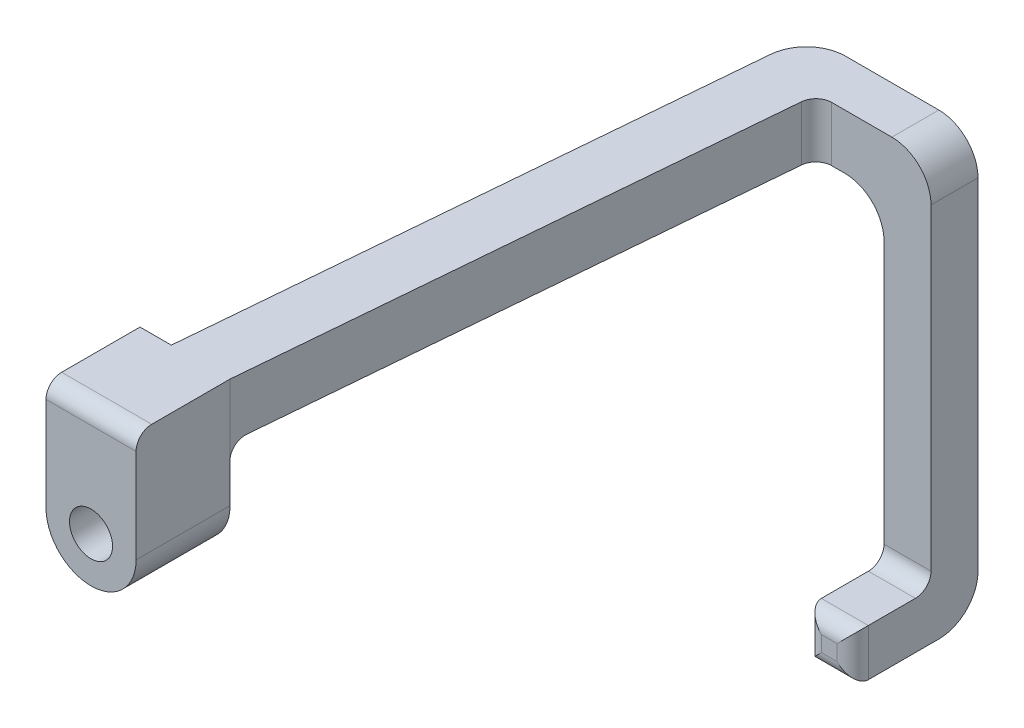
ISO-10303-21;
HEADER;
FILE_DESCRIPTION(('STEP AP214'),'2;1');
FILE_NAME('part.step','',(''),(''),'','','');
FILE_SCHEMA(('AUTOMOTIVE_DESIGN { 1 0 10303 214 1 1 1 1 }'));
ENDSEC;
DATA;
#1=APPLICATION_CONTEXT('core data for automotive mechanical design processes');
#2=APPLICATION_PROTOCOL_DEFINITION('international standard','automotive_design',2000,#1);
#3=PRODUCT_CONTEXT('',#1,'mechanical');
#4=PRODUCT('Part','Part','',(#3));
#5=PRODUCT_RELATED_PRODUCT_CATEGORY('part','',(#4));
#6=PRODUCT_DEFINITION_FORMATION('','',#4);
#7=PRODUCT_DEFINITION_CONTEXT('part definition',#1,'design');
#8=PRODUCT_DEFINITION('design','',#6,#7);
#9=PRODUCT_DEFINITION_SHAPE('','',#8);
#10=(LENGTH_UNIT() NAMED_UNIT(*) SI_UNIT(.MILLI.,.METRE.));
#11=(NAMED_UNIT(*) PLANE_ANGLE_UNIT() SI_UNIT($,.RADIAN.));
#12=(NAMED_UNIT(*) SI_UNIT($,.STERADIAN.) SOLID_ANGLE_UNIT());
#13=UNCERTAINTY_MEASURE_WITH_UNIT(LENGTH_MEASURE(1.E-05),#10,'distance_accuracy_value','');
#14=(GEOMETRIC_REPRESENTATION_CONTEXT(3) GLOBAL_UNCERTAINTY_ASSIGNED_CONTEXT((#13)) GLOBAL_UNIT_ASSIGNED_CONTEXT((#10,
#11,#12)) REPRESENTATION_CONTEXT('',''));
#15=CARTESIAN_POINT('',(0.,0.,0.));
#16=DIRECTION('',(0.,0.,1.));
#17=DIRECTION('',(1.,0.,0.));
#18=AXIS2_PLACEMENT_3D('',#15,#16,#17);
#19=CARTESIAN_POINT('',(1.37658783702771,7.,-34.5));
#20=DIRECTION('',(0.,0.,1.));
#21=DIRECTION('',(1.,0.,0.));
#22=AXIS2_PLACEMENT_3D('',#19,#20,#21);
#23=PLANE('',#22);
#24=DIRECTION('',(1.,0.,0.));
#25=VECTOR('',#24,1.);
#26=CARTESIAN_POINT('',(1.37658783702771,7.,-34.5));
#27=LINE('',#26,#25);
#28=CARTESIAN_POINT('',(6.78208186315099,7.,-34.5));
#29=VERTEX_POINT('',#28);
#30=CARTESIAN_POINT('',(10.625,7.,-34.5));
#31=VERTEX_POINT('',#30);
#32=EDGE_CURVE('E220',#29,#31,#27,.T.);
#33=ORIENTED_EDGE('',*,*,#32,.F.);
#34=DIRECTION('',(0.,-1.,0.));
#35=VECTOR('',#34,1.);
#36=CARTESIAN_POINT('',(6.78208186315099,7.,-34.5));
#37=LINE('',#36,#35);
#38=CARTESIAN_POINT('',(6.78208186315099,3.5,-34.5));
#39=VERTEX_POINT('',#38);
#40=EDGE_CURVE('E373',#29,#39,#37,.T.);
#41=ORIENTED_EDGE('',*,*,#40,.T.);
#42=DIRECTION('',(1.,0.,0.));
#43=VECTOR('',#42,1.);
#44=CARTESIAN_POINT('',(1.37658783702771,3.5,-34.5));
#45=LINE('',#44,#43);
#46=CARTESIAN_POINT('',(7.625,3.5,-34.5));
#47=VERTEX_POINT('',#46);
#48=EDGE_CURVE('E377',#39,#47,#45,.T.);
#49=ORIENTED_EDGE('',*,*,#48,.T.);
#50=CARTESIAN_POINT('',(7.625,0.999999999999999,-34.5));
#51=DIRECTION('',(0.,0.,1.));
#52=DIRECTION('',(1.,0.,0.));
#53=AXIS2_PLACEMENT_3D('',#50,#51,#52);
#54=CIRCLE('',#53,2.5);
#55=CARTESIAN_POINT('',(10.125,0.99999999999999,-34.5));
#56=VERTEX_POINT('',#55);
#57=EDGE_CURVE('E527',#47,#56,#54,.F.);
#58=ORIENTED_EDGE('',*,*,#57,.T.);
#59=DIRECTION('',(0.,1.,0.));
#60=VECTOR('',#59,1.);
#61=CARTESIAN_POINT('',(10.125,-19.75,-34.5));
#62=LINE('',#61,#60);
#63=CARTESIAN_POINT('',(10.125,-15.75,-34.5));
#64=VERTEX_POINT('',#63);
#65=EDGE_CURVE('E473',#64,#56,#62,.T.);
#66=ORIENTED_EDGE('',*,*,#65,.F.);
#67=DIRECTION('',(-1.,0.,0.));
#68=VECTOR('',#67,1.);
#69=CARTESIAN_POINT('',(1.37658783702771,-15.75,-34.5));
#70=LINE('',#69,#68);
#71=CARTESIAN_POINT('',(13.125,-15.75,-34.5));
#72=VERTEX_POINT('',#71);
#73=EDGE_CURVE('E385',#64,#72,#70,.F.);
#74=ORIENTED_EDGE('',*,*,#73,.T.);
#75=DIRECTION('',(0.,-1.,0.));
#76=VECTOR('',#75,1.);
#77=CARTESIAN_POINT('',(13.125,7.,-34.5));
#78=LINE('',#77,#76);
#79=CARTESIAN_POINT('',(13.125,4.5,-34.5));
#80=VERTEX_POINT('',#79);
#81=EDGE_CURVE('E480',#80,#72,#78,.T.);
#82=ORIENTED_EDGE('',*,*,#81,.F.);
#83=CARTESIAN_POINT('',(10.625,4.5,-34.5));
#84=DIRECTION('',(0.,0.,1.));
#85=DIRECTION('',(1.,0.,0.));
#86=AXIS2_PLACEMENT_3D('',#83,#84,#85);
#87=CIRCLE('',#86,2.5);
#88=EDGE_CURVE('E376',#80,#31,#87,.T.);
#89=ORIENTED_EDGE('',*,*,#88,.T.);
#90=EDGE_LOOP('',(#33,#41,#49,#58,#66,#74,#82,#89));
#91=FACE_BOUND('',#90,.T.);
#92=ADVANCED_FACE('F49',(#91),#23,.T.);
#93=CARTESIAN_POINT('',(0.,0.,6.));
#94=DIRECTION('',(0.,0.,1.));
#95=DIRECTION('',(1.,0.,0.));
#96=AXIS2_PLACEMENT_3D('',#93,#94,#95);
#97=PLANE('',#96);
#98=DIRECTION('',(0.,1.,0.));
#99=VECTOR('',#98,1.);
#100=CARTESIAN_POINT('',(2.875,0.,6.));
#101=LINE('',#100,#99);
#102=CARTESIAN_POINT('',(2.875,0.,6.));
#103=VERTEX_POINT('',#102);
#104=CARTESIAN_POINT('',(2.875,6.,6.));
#105=VERTEX_POINT('',#104);
#106=EDGE_CURVE('E278',#103,#105,#101,.T.);
#107=ORIENTED_EDGE('',*,*,#106,.T.);
#108=DIRECTION('',(-1.,0.,0.));
#109=VECTOR('',#108,1.);
#110=CARTESIAN_POINT('',(-2.875,6.,6.));
#111=LINE('',#110,#109);
#112=CARTESIAN_POINT('',(-2.875,6.,6.));
#113=VERTEX_POINT('',#112);
#114=EDGE_CURVE('E387',#105,#113,#111,.T.);
#115=ORIENTED_EDGE('',*,*,#114,.T.);
#116=DIRECTION('',(0.,-1.,0.));
#117=VECTOR('',#116,1.);
#118=CARTESIAN_POINT('',(-2.875,0.,6.));
#119=LINE('',#118,#117);
#120=CARTESIAN_POINT('',(-2.875,0.,6.));
#121=VERTEX_POINT('',#120);
#122=EDGE_CURVE('E282',#113,#121,#119,.T.);
#123=ORIENTED_EDGE('',*,*,#122,.T.);
#124=CARTESIAN_POINT('',(0.,0.,6.));
#125=DIRECTION('',(0.,0.,1.));
#126=DIRECTION('',(1.,0.,0.));
#127=AXIS2_PLACEMENT_3D('',#124,#125,#126);
#128=CIRCLE('',#127,2.875);
#129=EDGE_CURVE('E275',#121,#103,#128,.T.);
#130=ORIENTED_EDGE('',*,*,#129,.T.);
#131=EDGE_LOOP('',(#107,#115,#123,#130));
#132=FACE_BOUND('',#131,.T.);
#133=CARTESIAN_POINT('',(0.,0.,6.));
#134=DIRECTION('',(0.,0.,1.));
#135=DIRECTION('',(1.,0.,0.));
#136=AXIS2_PLACEMENT_3D('',#133,#134,#135);
#137=CIRCLE('',#136,1.375);
#138=CARTESIAN_POINT('',(1.375,0.,6.));
#139=VERTEX_POINT('',#138);
#140=EDGE_CURVE('E264',#139,#139,#137,.T.);
#141=ORIENTED_EDGE('',*,*,#140,.F.);
#142=EDGE_LOOP('',(#141));
#143=FACE_BOUND('',#142,.T.);
#144=ADVANCED_FACE('F361',(#132,#143),#97,.T.);
#145=CARTESIAN_POINT('',(0.,0.,0.));
#146=DIRECTION('',(0.,0.,1.));
#147=DIRECTION('',(1.,0.,0.));
#148=AXIS2_PLACEMENT_3D('',#145,#146,#147);
#149=PLANE('',#148);
#150=DIRECTION('',(0.,1.,0.));
#151=VECTOR('',#150,1.);
#152=CARTESIAN_POINT('',(-0.875,7.,0.));
#153=LINE('',#152,#151);
#154=CARTESIAN_POINT('',(-0.875,2.5,0.));
#155=VERTEX_POINT('',#154);
#156=CARTESIAN_POINT('',(-0.875,7.,0.));
#157=VERTEX_POINT('',#156);
#158=EDGE_CURVE('E67',#155,#157,#153,.T.);
#159=ORIENTED_EDGE('',*,*,#158,.F.);
#160=DIRECTION('',(-1.,0.,0.));
#161=VECTOR('',#160,1.);
#162=CARTESIAN_POINT('',(2.875,2.5,0.));
#163=LINE('',#162,#161);
#164=CARTESIAN_POINT('',(2.875,2.5,0.));
#165=VERTEX_POINT('',#164);
#166=EDGE_CURVE('E424',#155,#165,#163,.F.);
#167=ORIENTED_EDGE('',*,*,#166,.T.);
#168=DIRECTION('',(0.,1.,0.));
#169=VECTOR('',#168,1.);
#170=CARTESIAN_POINT('',(2.875,0.,0.));
#171=LINE('',#170,#169);
#172=CARTESIAN_POINT('',(2.875,0.,0.));
#173=VERTEX_POINT('',#172);
#174=EDGE_CURVE('E287',#173,#165,#171,.T.);
#175=ORIENTED_EDGE('',*,*,#174,.F.);
#176=CARTESIAN_POINT('',(0.,0.,0.));
#177=DIRECTION('',(0.,0.,1.));
#178=DIRECTION('',(1.,0.,0.));
#179=AXIS2_PLACEMENT_3D('',#176,#177,#178);
#180=CIRCLE('',#179,2.875);
#181=CARTESIAN_POINT('',(-2.875,0.,0.));
#182=VERTEX_POINT('',#181);
#183=EDGE_CURVE('E272',#182,#173,#180,.T.);
#184=ORIENTED_EDGE('',*,*,#183,.F.);
#185=DIRECTION('',(0.,-1.,0.));
#186=VECTOR('',#185,1.);
#187=CARTESIAN_POINT('',(-2.875,0.,0.));
#188=LINE('',#187,#186);
#189=CARTESIAN_POINT('',(-2.875,7.,0.));
#190=VERTEX_POINT('',#189);
#191=EDGE_CURVE('E279',#190,#182,#188,.T.);
#192=ORIENTED_EDGE('',*,*,#191,.F.);
#193=DIRECTION('',(-1.,0.,0.));
#194=VECTOR('',#193,1.);
#195=CARTESIAN_POINT('',(2.875,7.,0.));
#196=LINE('',#195,#194);
#197=EDGE_CURVE('E296',#157,#190,#196,.T.);
#198=ORIENTED_EDGE('',*,*,#197,.F.);
#199=EDGE_LOOP('',(#159,#167,#175,#184,#192,#198));
#200=FACE_BOUND('',#199,.T.);
#201=CARTESIAN_POINT('',(0.,0.,0.));
#202=DIRECTION('',(0.,0.,1.));
#203=DIRECTION('',(1.,0.,0.));
#204=AXIS2_PLACEMENT_3D('',#201,#202,#203);
#205=CIRCLE('',#204,1.375);
#206=CARTESIAN_POINT('',(1.375,0.,0.));
#207=VERTEX_POINT('',#206);
#208=EDGE_CURVE('E230',#207,#207,#205,.T.);
#209=ORIENTED_EDGE('',*,*,#208,.T.);
#210=EDGE_LOOP('',(#209));
#211=FACE_BOUND('',#210,.T.);
#212=ADVANCED_FACE('F367',(#200,#211),#149,.F.);
#213=CARTESIAN_POINT('',(0.,0.,6.));
#214=DIRECTION('',(0.,0.,-1.));
#215=DIRECTION('',(-1.,0.,0.));
#216=AXIS2_PLACEMENT_3D('',#213,#214,#215);
#217=CYLINDRICAL_SURFACE('',#216,2.875);
#218=ORIENTED_EDGE('',*,*,#183,.T.);
#219=DIRECTION('',(0.,0.,-1.));
#220=VECTOR('',#219,1.);
#221=CARTESIAN_POINT('',(2.875,0.,6.));
#222=LINE('',#221,#220);
#223=EDGE_CURVE('E305',#103,#173,#222,.T.);
#224=ORIENTED_EDGE('',*,*,#223,.F.);
#225=ORIENTED_EDGE('',*,*,#129,.F.);
#226=DIRECTION('',(0.,0.,-1.));
#227=VECTOR('',#226,1.);
#228=CARTESIAN_POINT('',(-2.875,0.,6.));
#229=LINE('',#228,#227);
#230=EDGE_CURVE('E284',#121,#182,#229,.T.);
#231=ORIENTED_EDGE('',*,*,#230,.T.);
#232=EDGE_LOOP('',(#218,#224,#225,#231));
#233=FACE_BOUND('',#232,.T.);
#234=ADVANCED_FACE('F417',(#233),#217,.T.);
#235=CARTESIAN_POINT('',(2.875,0.,6.));
#236=DIRECTION('',(-1.,0.,0.));
#237=DIRECTION('',(0.,-1.,0.));
#238=AXIS2_PLACEMENT_3D('',#235,#236,#237);
#239=PLANE('',#238);
#240=DIRECTION('',(0.,0.,-1.));
#241=VECTOR('',#240,1.);
#242=CARTESIAN_POINT('',(2.875,7.,6.));
#243=LINE('',#242,#241);
#244=CARTESIAN_POINT('',(2.875,7.,5.));
#245=VERTEX_POINT('',#244);
#246=CARTESIAN_POINT('',(2.875,7.,0.));
#247=VERTEX_POINT('',#246);
#248=EDGE_CURVE('E302',#245,#247,#243,.T.);
#249=ORIENTED_EDGE('',*,*,#248,.F.);
#250=CARTESIAN_POINT('',(2.875,6.,5.));
#251=DIRECTION('',(-1.,0.,0.));
#252=DIRECTION('',(0.,-1.,0.));
#253=AXIS2_PLACEMENT_3D('',#250,#251,#252);
#254=CIRCLE('',#253,1.);
#255=EDGE_CURVE('E311',#245,#105,#254,.F.);
#256=ORIENTED_EDGE('',*,*,#255,.T.);
#257=ORIENTED_EDGE('',*,*,#106,.F.);
#258=ORIENTED_EDGE('',*,*,#223,.T.);
#259=ORIENTED_EDGE('',*,*,#174,.T.);
#260=DIRECTION('',(0.,-1.,0.));
#261=VECTOR('',#260,1.);
#262=CARTESIAN_POINT('',(2.875,3.5,0.));
#263=LINE('',#262,#261);
#264=EDGE_CURVE('E427',#247,#165,#263,.T.);
#265=ORIENTED_EDGE('',*,*,#264,.F.);
#266=EDGE_LOOP('',(#249,#256,#257,#258,#259,#265));
#267=FACE_BOUND('',#266,.T.);
#268=ADVANCED_FACE('F409',(#267),#239,.F.);
#269=CARTESIAN_POINT('',(2.875,7.,6.));
#270=DIRECTION('',(0.,-1.,0.));
#271=DIRECTION('',(0.,0.,-1.));
#272=AXIS2_PLACEMENT_3D('',#269,#270,#271);
#273=PLANE('',#272);
#274=DIRECTION('',(0.,0.,-1.));
#275=VECTOR('',#274,1.);
#276=CARTESIAN_POINT('',(-2.875,7.,6.));
#277=LINE('',#276,#275);
#278=CARTESIAN_POINT('',(-2.875,7.,5.));
#279=VERTEX_POINT('',#278);
#280=EDGE_CURVE('E306',#279,#190,#277,.T.);
#281=ORIENTED_EDGE('',*,*,#280,.F.);
#282=DIRECTION('',(-1.,0.,0.));
#283=VECTOR('',#282,1.);
#284=CARTESIAN_POINT('',(2.875,7.,5.));
#285=LINE('',#284,#283);
#286=EDGE_CURVE('E309',#279,#245,#285,.F.);
#287=ORIENTED_EDGE('',*,*,#286,.T.);
#288=ORIENTED_EDGE('',*,*,#248,.T.);
#289=DIRECTION('',(0.0863430073291471,0.,-0.996265469182466));
#290=VECTOR('',#289,1.);
#291=CARTESIAN_POINT('',(2.875,7.,0.));
#292=LINE('',#291,#290);
#293=CARTESIAN_POINT('',(5.78581639396853,7.,-33.5863430073291));
#294=VERTEX_POINT('',#293);
#295=EDGE_CURVE('E327',#247,#294,#292,.T.);
#296=ORIENTED_EDGE('',*,*,#295,.T.);
#297=CARTESIAN_POINT('',(6.78208186315099,7.,-33.5));
#298=DIRECTION('',(0.,-1.,0.));
#299=DIRECTION('',(0.,0.,-1.));
#300=AXIS2_PLACEMENT_3D('',#297,#298,#299);
#301=CIRCLE('',#300,1.);
#302=EDGE_CURVE('E382',#294,#29,#301,.T.);
#303=ORIENTED_EDGE('',*,*,#302,.T.);
#304=ORIENTED_EDGE('',*,*,#32,.T.);
#305=DIRECTION('',(0.,0.,1.));
#306=VECTOR('',#305,1.);
#307=CARTESIAN_POINT('',(10.625,7.,-37.5));
#308=LINE('',#307,#306);
#309=CARTESIAN_POINT('',(10.625,7.,-37.5));
#310=VERTEX_POINT('',#309);
#311=EDGE_CURVE('E217',#31,#310,#308,.F.);
#312=ORIENTED_EDGE('',*,*,#311,.T.);
#313=DIRECTION('',(-1.,0.,0.));
#314=VECTOR('',#313,1.);
#315=CARTESIAN_POINT('',(13.125,7.,-37.5));
#316=LINE('',#315,#314);
#317=CARTESIAN_POINT('',(6.125,7.,-37.5));
#318=VERTEX_POINT('',#317);
#319=EDGE_CURVE('E210',#310,#318,#316,.T.);
#320=ORIENTED_EDGE('',*,*,#319,.T.);
#321=DIRECTION('',(1.,0.,0.));
#322=VECTOR('',#321,1.);
#323=CARTESIAN_POINT('',(6.125,7.,-37.5));
#324=LINE('',#323,#322);
#325=CARTESIAN_POINT('',(4.66770465787748,7.,-37.5));
#326=VERTEX_POINT('',#325);
#327=EDGE_CURVE('E214',#326,#318,#324,.T.);
#328=ORIENTED_EDGE('',*,*,#327,.F.);
#329=CARTESIAN_POINT('',(4.66770465787748,7.,-35.));
#330=DIRECTION('',(0.,-1.,0.));
#331=DIRECTION('',(0.,0.,-1.));
#332=AXIS2_PLACEMENT_3D('',#329,#330,#331);
#333=CIRCLE('',#332,2.5);
#334=CARTESIAN_POINT('',(2.17704098492132,7.,-35.2158575183229));
#335=VERTEX_POINT('',#334);
#336=EDGE_CURVE('E513',#326,#335,#333,.F.);
#337=ORIENTED_EDGE('',*,*,#336,.T.);
#338=DIRECTION('',(0.0863430073291471,0.,-0.996265469182466));
#339=VECTOR('',#338,1.);
#340=CARTESIAN_POINT('',(-0.875,7.,0.));
#341=LINE('',#340,#339);
#342=EDGE_CURVE('E324',#157,#335,#341,.T.);
#343=ORIENTED_EDGE('',*,*,#342,.F.);
#344=ORIENTED_EDGE('',*,*,#197,.T.);
#345=EDGE_LOOP('',(#281,#287,#288,#296,#303,#304,#312,#320,#328,#337,#343,#344));
#346=FACE_BOUND('',#345,.T.);
#347=ADVANCED_FACE('F213',(#346),#273,.F.);
#348=CARTESIAN_POINT('',(-2.875,0.,6.));
#349=DIRECTION('',(1.,0.,0.));
#350=DIRECTION('',(0.,1.,0.));
#351=AXIS2_PLACEMENT_3D('',#348,#349,#350);
#352=PLANE('',#351);
#353=ORIENTED_EDGE('',*,*,#122,.F.);
#354=CARTESIAN_POINT('',(-2.875,6.,5.));
#355=DIRECTION('',(1.,0.,0.));
#356=DIRECTION('',(0.,1.,0.));
#357=AXIS2_PLACEMENT_3D('',#354,#355,#356);
#358=CIRCLE('',#357,1.);
#359=EDGE_CURVE('E307',#113,#279,#358,.F.);
#360=ORIENTED_EDGE('',*,*,#359,.T.);
#361=ORIENTED_EDGE('',*,*,#280,.T.);
#362=ORIENTED_EDGE('',*,*,#191,.T.);
#363=ORIENTED_EDGE('',*,*,#230,.F.);
#364=EDGE_LOOP('',(#353,#360,#361,#362,#363));
#365=FACE_BOUND('',#364,.T.);
#366=ADVANCED_FACE('F397',(#365),#352,.F.);
#367=CARTESIAN_POINT('',(0.,0.,6.));
#368=DIRECTION('',(0.,0.,-1.));
#369=DIRECTION('',(-1.,0.,0.));
#370=AXIS2_PLACEMENT_3D('',#367,#368,#369);
#371=CYLINDRICAL_SURFACE('',#370,1.375);
#372=ORIENTED_EDGE('',*,*,#140,.T.);
#373=EDGE_LOOP('',(#372));
#374=FACE_BOUND('',#373,.T.);
#375=ORIENTED_EDGE('',*,*,#208,.F.);
#376=EDGE_LOOP('',(#375));
#377=FACE_BOUND('',#376,.T.);
#378=ADVANCED_FACE('F256',(#374,#377),#371,.F.);
#379=CARTESIAN_POINT('',(0.,0.,-37.5));
#380=DIRECTION('',(0.,0.,1.));
#381=DIRECTION('',(1.,0.,0.));
#382=AXIS2_PLACEMENT_3D('',#379,#380,#381);
#383=PLANE('',#382);
#384=DIRECTION('',(0.,1.,0.));
#385=VECTOR('',#384,1.);
#386=CARTESIAN_POINT('',(13.125,7.,-37.5));
#387=LINE('',#386,#385);
#388=CARTESIAN_POINT('',(13.125,-17.25,-37.5));
#389=VERTEX_POINT('',#388);
#390=CARTESIAN_POINT('',(13.125,4.5,-37.5));
#391=VERTEX_POINT('',#390);
#392=EDGE_CURVE('E475',#389,#391,#387,.T.);
#393=ORIENTED_EDGE('',*,*,#392,.F.);
#394=DIRECTION('',(-1.,0.,0.));
#395=VECTOR('',#394,1.);
#396=CARTESIAN_POINT('',(0.,-17.25,-37.5));
#397=LINE('',#396,#395);
#398=CARTESIAN_POINT('',(10.125,-17.25,-37.5));
#399=VERTEX_POINT('',#398);
#400=EDGE_CURVE('E495',#389,#399,#397,.T.);
#401=ORIENTED_EDGE('',*,*,#400,.T.);
#402=DIRECTION('',(0.,1.,0.));
#403=VECTOR('',#402,1.);
#404=CARTESIAN_POINT('',(10.125,-19.75,-37.5));
#405=LINE('',#404,#403);
#406=CARTESIAN_POINT('',(10.125,0.99999999999999,-37.5));
#407=VERTEX_POINT('',#406);
#408=EDGE_CURVE('E472',#399,#407,#405,.T.);
#409=ORIENTED_EDGE('',*,*,#408,.T.);
#410=CARTESIAN_POINT('',(7.625,0.999999999999999,-37.5));
#411=DIRECTION('',(0.,0.,1.));
#412=DIRECTION('',(1.,0.,0.));
#413=AXIS2_PLACEMENT_3D('',#410,#411,#412);
#414=CIRCLE('',#413,2.5);
#415=CARTESIAN_POINT('',(7.625,3.5,-37.5));
#416=VERTEX_POINT('',#415);
#417=EDGE_CURVE('E529',#407,#416,#414,.T.);
#418=ORIENTED_EDGE('',*,*,#417,.T.);
#419=DIRECTION('',(-1.,0.,0.));
#420=VECTOR('',#419,1.);
#421=CARTESIAN_POINT('',(13.125,3.5,-37.5));
#422=LINE('',#421,#420);
#423=CARTESIAN_POINT('',(6.125,3.5,-37.5));
#424=VERTEX_POINT('',#423);
#425=EDGE_CURVE('E221',#416,#424,#422,.T.);
#426=ORIENTED_EDGE('',*,*,#425,.T.);
#427=DIRECTION('',(-1.,0.,0.));
#428=VECTOR('',#427,1.);
#429=CARTESIAN_POINT('',(2.375,3.5,-37.5));
#430=LINE('',#429,#428);
#431=CARTESIAN_POINT('',(4.66770465787748,3.5,-37.5));
#432=VERTEX_POINT('',#431);
#433=EDGE_CURVE('E231',#424,#432,#430,.T.);
#434=ORIENTED_EDGE('',*,*,#433,.T.);
#435=DIRECTION('',(0.,1.,0.));
#436=VECTOR('',#435,1.);
#437=CARTESIAN_POINT('',(4.66770465787748,0.,-37.5));
#438=LINE('',#437,#436);
#439=EDGE_CURVE('E229',#432,#326,#438,.T.);
#440=ORIENTED_EDGE('',*,*,#439,.T.);
#441=ORIENTED_EDGE('',*,*,#327,.T.);
#442=ORIENTED_EDGE('',*,*,#319,.F.);
#443=CARTESIAN_POINT('',(10.625,4.5,-37.5));
#444=DIRECTION('',(0.,0.,1.));
#445=DIRECTION('',(1.,0.,0.));
#446=AXIS2_PLACEMENT_3D('',#443,#444,#445);
#447=CIRCLE('',#446,2.5);
#448=EDGE_CURVE('E419',#310,#391,#447,.F.);
#449=ORIENTED_EDGE('',*,*,#448,.T.);
#450=EDGE_LOOP('',(#393,#401,#409,#418,#426,#434,#440,#441,#442,#449));
#451=FACE_BOUND('',#450,.T.);
#452=ADVANCED_FACE('F226',(#451),#383,.F.);
#453=CARTESIAN_POINT('',(0.,3.5,0.));
#454=DIRECTION('',(0.,1.,0.));
#455=DIRECTION('',(-1.,0.,0.));
#456=AXIS2_PLACEMENT_3D('',#453,#454,#455);
#457=PLANE('',#456);
#458=DIRECTION('',(0.0863430073291471,0.,-0.996265469182466));
#459=VECTOR('',#458,1.);
#460=CARTESIAN_POINT('',(2.875,3.5,0.));
#461=LINE('',#460,#459);
#462=CARTESIAN_POINT('',(2.96166666666667,3.5,-1.));
#463=VERTEX_POINT('',#462);
#464=CARTESIAN_POINT('',(5.78581639396853,3.5,-33.5863430073291));
#465=VERTEX_POINT('',#464);
#466=EDGE_CURVE('E317',#463,#465,#461,.T.);
#467=ORIENTED_EDGE('',*,*,#466,.F.);
#468=DIRECTION('',(-1.,0.,0.));
#469=VECTOR('',#468,1.);
#470=CARTESIAN_POINT('',(-0.875,3.5,-1.));
#471=LINE('',#470,#469);
#472=CARTESIAN_POINT('',(-0.788333333333334,3.5,-1.));
#473=VERTEX_POINT('',#472);
#474=EDGE_CURVE('E313',#463,#473,#471,.T.);
#475=ORIENTED_EDGE('',*,*,#474,.T.);
#476=DIRECTION('',(0.0863430073291471,0.,-0.996265469182466));
#477=VECTOR('',#476,1.);
#478=CARTESIAN_POINT('',(-0.875,3.5,0.));
#479=LINE('',#478,#477);
#480=CARTESIAN_POINT('',(2.17704098492132,3.5,-35.2158575183229));
#481=VERTEX_POINT('',#480);
#482=EDGE_CURVE('E314',#473,#481,#479,.T.);
#483=ORIENTED_EDGE('',*,*,#482,.T.);
#484=CARTESIAN_POINT('',(4.66770465787748,3.5,-35.));
#485=DIRECTION('',(0.,1.,0.));
#486=DIRECTION('',(-1.,0.,0.));
#487=AXIS2_PLACEMENT_3D('',#484,#485,#486);
#488=CIRCLE('',#487,2.5);
#489=EDGE_CURVE('E522',#481,#432,#488,.F.);
#490=ORIENTED_EDGE('',*,*,#489,.T.);
#491=ORIENTED_EDGE('',*,*,#433,.F.);
#492=ORIENTED_EDGE('',*,*,#425,.F.);
#493=DIRECTION('',(0.,0.,1.));
#494=VECTOR('',#493,1.);
#495=CARTESIAN_POINT('',(7.625,3.5,0.));
#496=LINE('',#495,#494);
#497=EDGE_CURVE('E520',#416,#47,#496,.T.);
#498=ORIENTED_EDGE('',*,*,#497,.T.);
#499=ORIENTED_EDGE('',*,*,#48,.F.);
#500=CARTESIAN_POINT('',(6.78208186315099,3.5,-33.5));
#501=DIRECTION('',(0.,1.,0.));
#502=DIRECTION('',(-1.,0.,0.));
#503=AXIS2_PLACEMENT_3D('',#500,#501,#502);
#504=CIRCLE('',#503,1.);
#505=EDGE_CURVE('E383',#39,#465,#504,.T.);
#506=ORIENTED_EDGE('',*,*,#505,.T.);
#507=EDGE_LOOP('',(#467,#475,#483,#490,#491,#492,#498,#499,#506));
#508=FACE_BOUND('',#507,.T.);
#509=ADVANCED_FACE('F255',(#508),#457,.F.);
#510=CARTESIAN_POINT('',(2.85356654462041,0.,0.247309100533769));
#511=DIRECTION('',(-0.996265469182466,0.,-0.0863430073291471));
#512=DIRECTION('',(-0.0863430073291471,0.,0.996265469182466));
#513=AXIS2_PLACEMENT_3D('',#510,#511,#512);
#514=PLANE('',#513);
#515=ORIENTED_EDGE('',*,*,#466,.T.);
#516=DIRECTION('',(0.,-1.,0.));
#517=VECTOR('',#516,1.);
#518=CARTESIAN_POINT('',(5.78581639396853,0.,-33.5863430073291));
#519=LINE('',#518,#517);
#520=EDGE_CURVE('E384',#465,#294,#519,.F.);
#521=ORIENTED_EDGE('',*,*,#520,.T.);
#522=ORIENTED_EDGE('',*,*,#295,.F.);
#523=ORIENTED_EDGE('',*,*,#264,.T.);
#524=CARTESIAN_POINT('',(2.96166666666667,2.5,-1.));
#525=DIRECTION('',(-0.996265469182466,0.,-0.0863430073291471));
#526=DIRECTION('',(0.0863430073291471,0.,-0.996265469182466));
#527=AXIS2_PLACEMENT_3D('',#524,#525,#526);
#528=ELLIPSE('',#527,1.00374852981766,1.);
#529=EDGE_CURVE('E12',#165,#463,#528,.T.);
#530=ORIENTED_EDGE('',*,*,#529,.T.);
#531=EDGE_LOOP('',(#515,#521,#522,#523,#530));
#532=FACE_BOUND('',#531,.T.);
#533=ADVANCED_FACE('F350',(#532),#514,.F.);
#534=CARTESIAN_POINT('',(-0.868476774449691,0.,-0.0752679871189733));
#535=DIRECTION('',(0.996265469182466,0.,0.0863430073291471));
#536=DIRECTION('',(0.0863430073291471,0.,-0.996265469182466));
#537=AXIS2_PLACEMENT_3D('',#534,#535,#536);
#538=PLANE('',#537);
#539=ORIENTED_EDGE('',*,*,#342,.T.);
#540=DIRECTION('',(0.,1.,0.));
#541=VECTOR('',#540,1.);
#542=CARTESIAN_POINT('',(2.17704098492131,0.,-35.2158575183229));
#543=LINE('',#542,#541);
#544=EDGE_CURVE('E515',#335,#481,#543,.F.);
#545=ORIENTED_EDGE('',*,*,#544,.T.);
#546=ORIENTED_EDGE('',*,*,#482,.F.);
#547=CARTESIAN_POINT('',(-0.788333333333335,2.5,-1.));
#548=DIRECTION('',(0.996265469182466,0.,0.0863430073291471));
#549=DIRECTION('',(0.0863430073291471,0.,-0.996265469182466));
#550=AXIS2_PLACEMENT_3D('',#547,#548,#549);
#551=ELLIPSE('',#550,1.00374852981766,1.);
#552=EDGE_CURVE('E59',#473,#155,#551,.T.);
#553=ORIENTED_EDGE('',*,*,#552,.T.);
#554=ORIENTED_EDGE('',*,*,#158,.T.);
#555=EDGE_LOOP('',(#539,#545,#546,#553,#554));
#556=FACE_BOUND('',#555,.T.);
#557=ADVANCED_FACE('F257',(#556),#538,.F.);
#558=CARTESIAN_POINT('',(13.125,0.,0.));
#559=DIRECTION('',(1.,0.,0.));
#560=DIRECTION('',(0.,0.,-1.));
#561=AXIS2_PLACEMENT_3D('',#558,#559,#560);
#562=PLANE('',#561);
#563=DIRECTION('',(0.,0.,-1.));
#564=VECTOR('',#563,1.);
#565=CARTESIAN_POINT('',(13.125,-16.75,-29.5));
#566=LINE('',#565,#564);
#567=CARTESIAN_POINT('',(13.125,-16.75,-30.5));
#568=VERTEX_POINT('',#567);
#569=CARTESIAN_POINT('',(13.125,-16.75,-33.5));
#570=VERTEX_POINT('',#569);
#571=EDGE_CURVE('E459',#568,#570,#566,.T.);
#572=ORIENTED_EDGE('',*,*,#571,.F.);
#573=DIRECTION('',(0.,1.,0.));
#574=VECTOR('',#573,1.);
#575=CARTESIAN_POINT('',(13.125,-19.75,-30.5));
#576=LINE('',#575,#574);
#577=CARTESIAN_POINT('',(13.125,-19.75,-30.5));
#578=VERTEX_POINT('',#577);
#579=EDGE_CURVE('E548',#568,#578,#576,.F.);
#580=ORIENTED_EDGE('',*,*,#579,.T.);
#581=DIRECTION('',(0.,0.,-1.));
#582=VECTOR('',#581,1.);
#583=CARTESIAN_POINT('',(13.125,-19.75,0.));
#584=LINE('',#583,#582);
#585=CARTESIAN_POINT('',(13.125,-19.75,-35.));
#586=VERTEX_POINT('',#585);
#587=EDGE_CURVE('E465',#578,#586,#584,.T.);
#588=ORIENTED_EDGE('',*,*,#587,.T.);
#589=CARTESIAN_POINT('',(13.125,-17.25,-35.));
#590=DIRECTION('',(1.,0.,0.));
#591=DIRECTION('',(0.,0.,-1.));
#592=AXIS2_PLACEMENT_3D('',#589,#590,#591);
#593=CIRCLE('',#592,2.5);
#594=EDGE_CURVE('E510',#586,#389,#593,.T.);
#595=ORIENTED_EDGE('',*,*,#594,.T.);
#596=ORIENTED_EDGE('',*,*,#392,.T.);
#597=DIRECTION('',(0.,0.,1.));
#598=VECTOR('',#597,1.);
#599=CARTESIAN_POINT('',(13.125,4.5,-34.5));
#600=LINE('',#599,#598);
#601=EDGE_CURVE('E507',#391,#80,#600,.T.);
#602=ORIENTED_EDGE('',*,*,#601,.T.);
#603=ORIENTED_EDGE('',*,*,#81,.T.);
#604=CARTESIAN_POINT('',(13.125,-15.75,-33.5));
#605=DIRECTION('',(1.,0.,0.));
#606=DIRECTION('',(0.,0.,-1.));
#607=AXIS2_PLACEMENT_3D('',#604,#605,#606);
#608=CIRCLE('',#607,1.);
#609=EDGE_CURVE('E440',#72,#570,#608,.F.);
#610=ORIENTED_EDGE('',*,*,#609,.T.);
#611=EDGE_LOOP('',(#572,#580,#588,#595,#596,#602,#603,#610));
#612=FACE_BOUND('',#611,.T.);
#613=ADVANCED_FACE('F357',(#612),#562,.T.);
#614=CARTESIAN_POINT('',(10.125,-19.75,0.));
#615=DIRECTION('',(-1.,0.,0.));
#616=DIRECTION('',(0.,0.,1.));
#617=AXIS2_PLACEMENT_3D('',#614,#615,#616);
#618=PLANE('',#617);
#619=DIRECTION('',(0.,0.,1.));
#620=VECTOR('',#619,1.);
#621=CARTESIAN_POINT('',(10.125,-19.75,0.));
#622=LINE('',#621,#620);
#623=CARTESIAN_POINT('',(10.125,-19.75,-35.));
#624=VERTEX_POINT('',#623);
#625=CARTESIAN_POINT('',(10.125,-19.75,-30.5));
#626=VERTEX_POINT('',#625);
#627=EDGE_CURVE('E469',#624,#626,#622,.T.);
#628=ORIENTED_EDGE('',*,*,#627,.T.);
#629=DIRECTION('',(0.,-1.,0.));
#630=VECTOR('',#629,1.);
#631=CARTESIAN_POINT('',(10.125,-16.75,-30.5));
#632=LINE('',#631,#630);
#633=CARTESIAN_POINT('',(10.125,-16.75,-30.5));
#634=VERTEX_POINT('',#633);
#635=EDGE_CURVE('E541',#626,#634,#632,.F.);
#636=ORIENTED_EDGE('',*,*,#635,.T.);
#637=DIRECTION('',(0.,0.,-1.));
#638=VECTOR('',#637,1.);
#639=CARTESIAN_POINT('',(10.125,-16.75,-29.5));
#640=LINE('',#639,#638);
#641=CARTESIAN_POINT('',(10.125,-16.75,-33.5));
#642=VERTEX_POINT('',#641);
#643=EDGE_CURVE('E453',#634,#642,#640,.T.);
#644=ORIENTED_EDGE('',*,*,#643,.T.);
#645=CARTESIAN_POINT('',(10.125,-15.75,-33.5));
#646=DIRECTION('',(-1.,0.,0.));
#647=DIRECTION('',(0.,0.,1.));
#648=AXIS2_PLACEMENT_3D('',#645,#646,#647);
#649=CIRCLE('',#648,1.);
#650=EDGE_CURVE('E436',#642,#64,#649,.F.);
#651=ORIENTED_EDGE('',*,*,#650,.T.);
#652=ORIENTED_EDGE('',*,*,#65,.T.);
#653=DIRECTION('',(0.,0.,1.));
#654=VECTOR('',#653,1.);
#655=CARTESIAN_POINT('',(10.125,0.999999999999997,0.));
#656=LINE('',#655,#654);
#657=EDGE_CURVE('E500',#56,#407,#656,.F.);
#658=ORIENTED_EDGE('',*,*,#657,.T.);
#659=ORIENTED_EDGE('',*,*,#408,.F.);
#660=CARTESIAN_POINT('',(10.125,-17.25,-35.));
#661=DIRECTION('',(-1.,0.,0.));
#662=DIRECTION('',(0.,0.,1.));
#663=AXIS2_PLACEMENT_3D('',#660,#661,#662);
#664=CIRCLE('',#663,2.5);
#665=EDGE_CURVE('E502',#399,#624,#664,.T.);
#666=ORIENTED_EDGE('',*,*,#665,.T.);
#667=EDGE_LOOP('',(#628,#636,#644,#651,#652,#658,#659,#666));
#668=FACE_BOUND('',#667,.T.);
#669=ADVANCED_FACE('F556',(#668),#618,.T.);
#670=CARTESIAN_POINT('',(0.,-19.75,0.));
#671=DIRECTION('',(0.,1.,0.));
#672=DIRECTION('',(-1.,0.,0.));
#673=AXIS2_PLACEMENT_3D('',#670,#671,#672);
#674=PLANE('',#673);
#675=ORIENTED_EDGE('',*,*,#587,.F.);
#676=DIRECTION('',(1.,0.,0.));
#677=VECTOR('',#676,1.);
#678=CARTESIAN_POINT('',(0.,-19.75,-30.5));
#679=LINE('',#678,#677);
#680=EDGE_CURVE('E389',#578,#626,#679,.F.);
#681=ORIENTED_EDGE('',*,*,#680,.T.);
#682=ORIENTED_EDGE('',*,*,#627,.F.);
#683=DIRECTION('',(-1.,0.,0.));
#684=VECTOR('',#683,1.);
#685=CARTESIAN_POINT('',(0.,-19.75,-35.));
#686=LINE('',#685,#684);
#687=EDGE_CURVE('E504',#624,#586,#686,.F.);
#688=ORIENTED_EDGE('',*,*,#687,.T.);
#689=EDGE_LOOP('',(#675,#681,#682,#688));
#690=FACE_BOUND('',#689,.T.);
#691=ADVANCED_FACE('F552',(#690),#674,.F.);
#692=CARTESIAN_POINT('',(13.125,-16.75,-29.5));
#693=DIRECTION('',(0.,-1.,0.));
#694=DIRECTION('',(0.,0.,-1.));
#695=AXIS2_PLACEMENT_3D('',#692,#693,#694);
#696=PLANE('',#695);
#697=ORIENTED_EDGE('',*,*,#643,.F.);
#698=DIRECTION('',(-1.,0.,0.));
#699=VECTOR('',#698,1.);
#700=CARTESIAN_POINT('',(13.125,-16.75,-30.5));
#701=LINE('',#700,#699);
#702=EDGE_CURVE('E546',#634,#568,#701,.F.);
#703=ORIENTED_EDGE('',*,*,#702,.T.);
#704=ORIENTED_EDGE('',*,*,#571,.T.);
#705=DIRECTION('',(-1.,0.,0.));
#706=VECTOR('',#705,1.);
#707=CARTESIAN_POINT('',(13.125,-16.75,-33.5));
#708=LINE('',#707,#706);
#709=EDGE_CURVE('E543',#570,#642,#708,.T.);
#710=ORIENTED_EDGE('',*,*,#709,.T.);
#711=EDGE_LOOP('',(#697,#703,#704,#710));
#712=FACE_BOUND('',#711,.T.);
#713=ADVANCED_FACE('F569',(#712),#696,.F.);
#714=CARTESIAN_POINT('',(0.,0.,-29.5));
#715=DIRECTION('',(0.,0.,-1.));
#716=DIRECTION('',(-1.,0.,0.));
#717=AXIS2_PLACEMENT_3D('',#714,#715,#716);
#718=PLANE('',#717);
#719=DIRECTION('',(-1.,0.,0.));
#720=VECTOR('',#719,1.);
#721=CARTESIAN_POINT('',(0.,-17.75,-29.5));
#722=LINE('',#721,#720);
#723=CARTESIAN_POINT('',(12.125,-17.75,-29.5));
#724=VERTEX_POINT('',#723);
#725=CARTESIAN_POINT('',(11.125,-17.75,-29.5));
#726=VERTEX_POINT('',#725);
#727=EDGE_CURVE('E536',#724,#726,#722,.T.);
#728=ORIENTED_EDGE('',*,*,#727,.T.);
#729=DIRECTION('',(0.,-1.,0.));
#730=VECTOR('',#729,1.);
#731=CARTESIAN_POINT('',(11.125,-19.75,-29.5));
#732=LINE('',#731,#730);
#733=CARTESIAN_POINT('',(11.125,-18.75,-29.5));
#734=VERTEX_POINT('',#733);
#735=EDGE_CURVE('E538',#726,#734,#732,.T.);
#736=ORIENTED_EDGE('',*,*,#735,.T.);
#737=DIRECTION('',(1.,0.,0.));
#738=VECTOR('',#737,1.);
#739=CARTESIAN_POINT('',(0.,-18.75,-29.5));
#740=LINE('',#739,#738);
#741=CARTESIAN_POINT('',(12.125,-18.75,-29.5));
#742=VERTEX_POINT('',#741);
#743=EDGE_CURVE('E530',#734,#742,#740,.T.);
#744=ORIENTED_EDGE('',*,*,#743,.T.);
#745=DIRECTION('',(0.,1.,0.));
#746=VECTOR('',#745,1.);
#747=CARTESIAN_POINT('',(12.125,-16.75,-29.5));
#748=LINE('',#747,#746);
#749=EDGE_CURVE('E534',#742,#724,#748,.T.);
#750=ORIENTED_EDGE('',*,*,#749,.T.);
#751=EDGE_LOOP('',(#728,#736,#744,#750));
#752=FACE_BOUND('',#751,.T.);
#753=ADVANCED_FACE('F565',(#752),#718,.F.);
#754=CARTESIAN_POINT('',(0.,-17.25,-35.));
#755=DIRECTION('',(-1.,0.,0.));
#756=DIRECTION('',(0.,-1.,0.));
#757=AXIS2_PLACEMENT_3D('',#754,#755,#756);
#758=CYLINDRICAL_SURFACE('',#757,2.5);
#759=ORIENTED_EDGE('',*,*,#594,.F.);
#760=ORIENTED_EDGE('',*,*,#687,.F.);
#761=ORIENTED_EDGE('',*,*,#665,.F.);
#762=ORIENTED_EDGE('',*,*,#400,.F.);
#763=EDGE_LOOP('',(#759,#760,#761,#762));
#764=FACE_BOUND('',#763,.T.);
#765=ADVANCED_FACE('F667',(#764),#758,.T.);
#766=CARTESIAN_POINT('',(4.66770465787748,0.,-35.));
#767=DIRECTION('',(0.,1.,0.));
#768=DIRECTION('',(-1.,0.,0.));
#769=AXIS2_PLACEMENT_3D('',#766,#767,#768);
#770=CYLINDRICAL_SURFACE('',#769,2.5);
#771=ORIENTED_EDGE('',*,*,#489,.F.);
#772=ORIENTED_EDGE('',*,*,#544,.F.);
#773=ORIENTED_EDGE('',*,*,#336,.F.);
#774=ORIENTED_EDGE('',*,*,#439,.F.);
#775=EDGE_LOOP('',(#771,#772,#773,#774));
#776=FACE_BOUND('',#775,.T.);
#777=ADVANCED_FACE('F657',(#776),#770,.T.);
#778=CARTESIAN_POINT('',(7.625,0.999999999999999,0.));
#779=DIRECTION('',(0.,0.,1.));
#780=DIRECTION('',(0.,-1.,0.));
#781=AXIS2_PLACEMENT_3D('',#778,#779,#780);
#782=CYLINDRICAL_SURFACE('',#781,2.5);
#783=ORIENTED_EDGE('',*,*,#417,.F.);
#784=ORIENTED_EDGE('',*,*,#657,.F.);
#785=ORIENTED_EDGE('',*,*,#57,.F.);
#786=ORIENTED_EDGE('',*,*,#497,.F.);
#787=EDGE_LOOP('',(#783,#784,#785,#786));
#788=FACE_BOUND('',#787,.T.);
#789=ADVANCED_FACE('F584',(#788),#782,.F.);
#790=CARTESIAN_POINT('',(10.625,4.5,0.));
#791=DIRECTION('',(0.,0.,-1.));
#792=DIRECTION('',(-1.,0.,0.));
#793=AXIS2_PLACEMENT_3D('',#790,#791,#792);
#794=CYLINDRICAL_SURFACE('',#793,2.5);
#795=ORIENTED_EDGE('',*,*,#448,.F.);
#796=ORIENTED_EDGE('',*,*,#311,.F.);
#797=ORIENTED_EDGE('',*,*,#88,.F.);
#798=ORIENTED_EDGE('',*,*,#601,.F.);
#799=EDGE_LOOP('',(#795,#796,#797,#798));
#800=FACE_BOUND('',#799,.T.);
#801=ADVANCED_FACE('F577',(#800),#794,.T.);
#802=CARTESIAN_POINT('',(12.125,0.,-30.5));
#803=DIRECTION('',(0.,-1.,0.));
#804=DIRECTION('',(0.,0.,-1.));
#805=AXIS2_PLACEMENT_3D('',#802,#803,#804);
#806=CYLINDRICAL_SURFACE('',#805,1.);
#807=CARTESIAN_POINT('',(12.125,-18.75,-30.5));
#808=DIRECTION('',(0.707106781186548,0.707106781186547,0.));
#809=DIRECTION('',(0.707106781186547,-0.707106781186548,0.));
#810=AXIS2_PLACEMENT_3D('',#807,#808,#809);
#811=ELLIPSE('',#810,1.4142135623731,1.);
#812=EDGE_CURVE('E446',#578,#742,#811,.F.);
#813=ORIENTED_EDGE('',*,*,#812,.F.);
#814=ORIENTED_EDGE('',*,*,#579,.F.);
#815=CARTESIAN_POINT('',(12.125,-17.75,-30.5));
#816=DIRECTION('',(0.707106781186547,-0.707106781186547,0.));
#817=DIRECTION('',(-0.707106781186547,-0.707106781186547,0.));
#818=AXIS2_PLACEMENT_3D('',#815,#816,#817);
#819=ELLIPSE('',#818,1.41421356237309,1.);
#820=EDGE_CURVE('E53',#724,#568,#819,.F.);
#821=ORIENTED_EDGE('',*,*,#820,.F.);
#822=ORIENTED_EDGE('',*,*,#749,.F.);
#823=EDGE_LOOP('',(#813,#814,#821,#822));
#824=FACE_BOUND('',#823,.T.);
#825=ADVANCED_FACE('F575',(#824),#806,.T.);
#826=CARTESIAN_POINT('',(0.,-17.75,-30.5));
#827=DIRECTION('',(-1.,0.,0.));
#828=DIRECTION('',(0.,0.,1.));
#829=AXIS2_PLACEMENT_3D('',#826,#827,#828);
#830=CYLINDRICAL_SURFACE('',#829,1.);
#831=ORIENTED_EDGE('',*,*,#820,.T.);
#832=ORIENTED_EDGE('',*,*,#702,.F.);
#833=CARTESIAN_POINT('',(11.125,-17.75,-30.5));
#834=DIRECTION('',(-0.707106781186547,-0.707106781186547,0.));
#835=DIRECTION('',(-0.707106781186547,0.707106781186547,0.));
#836=AXIS2_PLACEMENT_3D('',#833,#834,#835);
#837=ELLIPSE('',#836,1.41421356237309,1.);
#838=EDGE_CURVE('E445',#726,#634,#837,.T.);
#839=ORIENTED_EDGE('',*,*,#838,.F.);
#840=ORIENTED_EDGE('',*,*,#727,.F.);
#841=EDGE_LOOP('',(#831,#832,#839,#840));
#842=FACE_BOUND('',#841,.T.);
#843=ADVANCED_FACE('F566',(#842),#830,.T.);
#844=CARTESIAN_POINT('',(0.,-18.75,-30.5));
#845=DIRECTION('',(1.,0.,0.));
#846=DIRECTION('',(0.,1.,0.));
#847=AXIS2_PLACEMENT_3D('',#844,#845,#846);
#848=CYLINDRICAL_SURFACE('',#847,1.);
#849=ORIENTED_EDGE('',*,*,#812,.T.);
#850=ORIENTED_EDGE('',*,*,#743,.F.);
#851=CARTESIAN_POINT('',(11.125,-18.75,-30.5));
#852=DIRECTION('',(0.707106781186547,-0.707106781186548,0.));
#853=DIRECTION('',(0.707106781186548,0.707106781186547,0.));
#854=AXIS2_PLACEMENT_3D('',#851,#852,#853);
#855=ELLIPSE('',#854,1.41421356237309,1.);
#856=EDGE_CURVE('E443',#626,#734,#855,.F.);
#857=ORIENTED_EDGE('',*,*,#856,.F.);
#858=ORIENTED_EDGE('',*,*,#680,.F.);
#859=EDGE_LOOP('',(#849,#850,#857,#858));
#860=FACE_BOUND('',#859,.T.);
#861=ADVANCED_FACE('F562',(#860),#848,.T.);
#862=CARTESIAN_POINT('',(11.125,0.,-30.5));
#863=DIRECTION('',(0.,1.,0.));
#864=DIRECTION('',(0.,0.,1.));
#865=AXIS2_PLACEMENT_3D('',#862,#863,#864);
#866=CYLINDRICAL_SURFACE('',#865,1.);
#867=ORIENTED_EDGE('',*,*,#838,.T.);
#868=ORIENTED_EDGE('',*,*,#635,.F.);
#869=ORIENTED_EDGE('',*,*,#856,.T.);
#870=ORIENTED_EDGE('',*,*,#735,.F.);
#871=EDGE_LOOP('',(#867,#868,#869,#870));
#872=FACE_BOUND('',#871,.T.);
#873=ADVANCED_FACE('F559',(#872),#866,.T.);
#874=CARTESIAN_POINT('',(6.78208186315099,7.,-33.5));
#875=DIRECTION('',(0.,-1.,0.));
#876=DIRECTION('',(0.,0.,-1.));
#877=AXIS2_PLACEMENT_3D('',#874,#875,#876);
#878=CYLINDRICAL_SURFACE('',#877,1.);
#879=ORIENTED_EDGE('',*,*,#302,.F.);
#880=ORIENTED_EDGE('',*,*,#520,.F.);
#881=ORIENTED_EDGE('',*,*,#505,.F.);
#882=ORIENTED_EDGE('',*,*,#40,.F.);
#883=EDGE_LOOP('',(#879,#880,#881,#882));
#884=FACE_BOUND('',#883,.T.);
#885=ADVANCED_FACE('F380',(#884),#878,.F.);
#886=CARTESIAN_POINT('',(13.125,-15.75,-33.5));
#887=DIRECTION('',(-1.,0.,0.));
#888=DIRECTION('',(0.,0.,1.));
#889=AXIS2_PLACEMENT_3D('',#886,#887,#888);
#890=CYLINDRICAL_SURFACE('',#889,1.);
#891=ORIENTED_EDGE('',*,*,#609,.F.);
#892=ORIENTED_EDGE('',*,*,#73,.F.);
#893=ORIENTED_EDGE('',*,*,#650,.F.);
#894=ORIENTED_EDGE('',*,*,#709,.F.);
#895=EDGE_LOOP('',(#891,#892,#893,#894));
#896=FACE_BOUND('',#895,.T.);
#897=ADVANCED_FACE('F591',(#896),#890,.F.);
#898=CARTESIAN_POINT('',(0.,6.,5.));
#899=DIRECTION('',(1.,0.,0.));
#900=DIRECTION('',(0.,0.,-1.));
#901=AXIS2_PLACEMENT_3D('',#898,#899,#900);
#902=CYLINDRICAL_SURFACE('',#901,1.);
#903=ORIENTED_EDGE('',*,*,#255,.F.);
#904=ORIENTED_EDGE('',*,*,#286,.F.);
#905=ORIENTED_EDGE('',*,*,#359,.F.);
#906=ORIENTED_EDGE('',*,*,#114,.F.);
#907=EDGE_LOOP('',(#903,#904,#905,#906));
#908=FACE_BOUND('',#907,.T.);
#909=ADVANCED_FACE('F407',(#908),#902,.T.);
#910=CARTESIAN_POINT('',(0.,2.5,-1.));
#911=DIRECTION('',(1.,0.,0.));
#912=DIRECTION('',(0.,1.,0.));
#913=AXIS2_PLACEMENT_3D('',#910,#911,#912);
#914=CYLINDRICAL_SURFACE('',#913,1.);
#915=ORIENTED_EDGE('',*,*,#529,.F.);
#916=ORIENTED_EDGE('',*,*,#166,.F.);
#917=ORIENTED_EDGE('',*,*,#552,.F.);
#918=ORIENTED_EDGE('',*,*,#474,.F.);
#919=EDGE_LOOP('',(#915,#916,#917,#918));
#920=FACE_BOUND('',#919,.T.);
#921=ADVANCED_FACE('F51',(#920),#914,.F.);
#922=CLOSED_SHELL('',(#92,#144,#212,#234,#268,#347,#366,#378,#452,#509,#533,#557,#613,#669,#691,
#713,#753,#765,#777,#789,#801,#825,#843,#861,#873,#885,#897,#909,#921));
#923=MANIFOLD_SOLID_BREP('B2',#922);
#924=ADVANCED_BREP_SHAPE_REPRESENTATION('',(#18,#923),#14);
#925=SHAPE_DEFINITION_REPRESENTATION(#9,#924);
ENDSEC;
END-ISO-10303-21;
